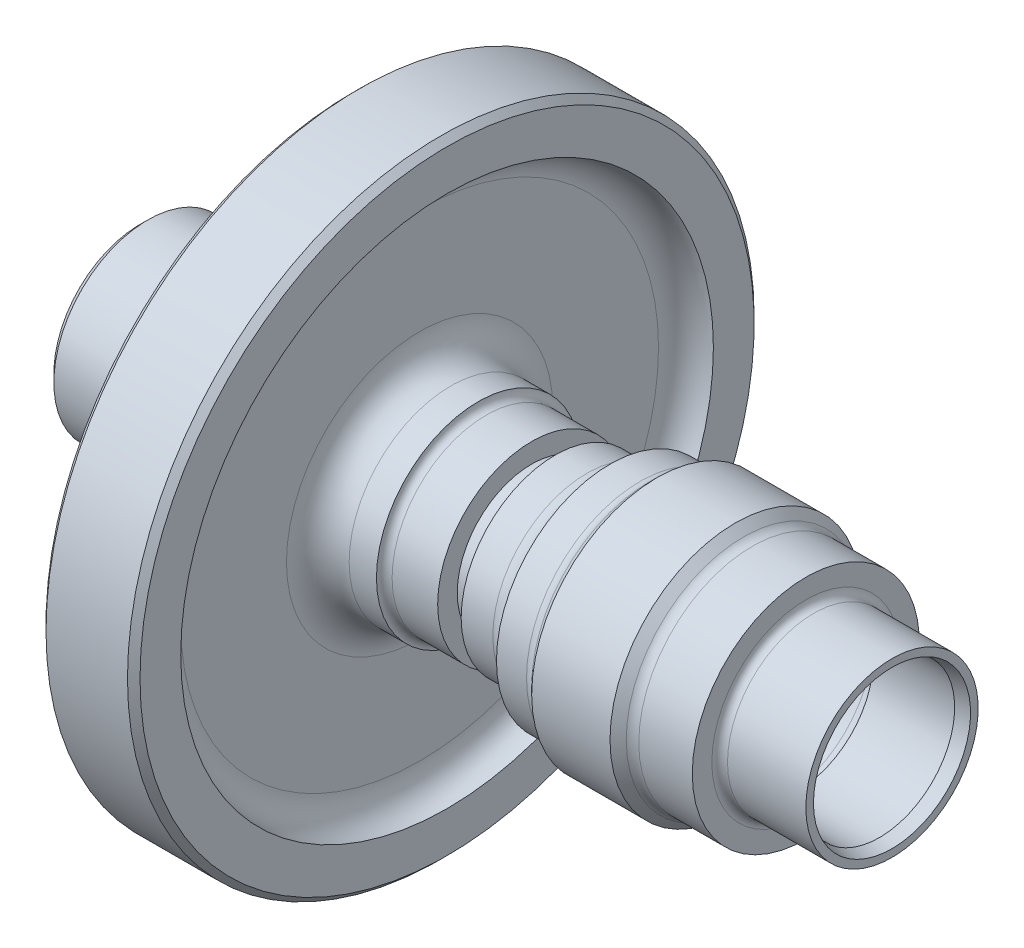
ISO-10303-21;
HEADER;
FILE_DESCRIPTION(('STEP AP214'),'2;1');
FILE_NAME('part.step','',(''),(''),'','','');
FILE_SCHEMA(('AUTOMOTIVE_DESIGN { 1 0 10303 214 1 1 1 1 }'));
ENDSEC;
DATA;
#1=APPLICATION_CONTEXT('core data for automotive mechanical design processes');
#2=APPLICATION_PROTOCOL_DEFINITION('international standard','automotive_design',2000,#1);
#3=PRODUCT_CONTEXT('',#1,'mechanical');
#4=PRODUCT('Part','Part','',(#3));
#5=PRODUCT_RELATED_PRODUCT_CATEGORY('part','',(#4));
#6=PRODUCT_DEFINITION_FORMATION('','',#4);
#7=PRODUCT_DEFINITION_CONTEXT('part definition',#1,'design');
#8=PRODUCT_DEFINITION('design','',#6,#7);
#9=PRODUCT_DEFINITION_SHAPE('','',#8);
#10=(LENGTH_UNIT() NAMED_UNIT(*) SI_UNIT(.MILLI.,.METRE.));
#11=(NAMED_UNIT(*) PLANE_ANGLE_UNIT() SI_UNIT($,.RADIAN.));
#12=(NAMED_UNIT(*) SI_UNIT($,.STERADIAN.) SOLID_ANGLE_UNIT());
#13=UNCERTAINTY_MEASURE_WITH_UNIT(LENGTH_MEASURE(1.E-05),#10,'distance_accuracy_value','');
#14=(GEOMETRIC_REPRESENTATION_CONTEXT(3) GLOBAL_UNCERTAINTY_ASSIGNED_CONTEXT((#13)) GLOBAL_UNIT_ASSIGNED_CONTEXT((#10,
#11,#12)) REPRESENTATION_CONTEXT('',''));
#15=CARTESIAN_POINT('',(0.,0.,0.));
#16=DIRECTION('',(0.,0.,1.));
#17=DIRECTION('',(1.,0.,0.));
#18=AXIS2_PLACEMENT_3D('',#15,#16,#17);
#19=CARTESIAN_POINT('',(171.840617081736,0.,0.));
#20=DIRECTION('',(1.,0.,0.));
#21=DIRECTION('',(0.,0.,-1.));
#22=AXIS2_PLACEMENT_3D('',#19,#20,#21);
#23=CYLINDRICAL_SURFACE('',#22,63.5);
#24=CARTESIAN_POINT('',(44.45,0.,0.));
#25=DIRECTION('',(1.,0.,0.));
#26=DIRECTION('',(0.,0.,-1.));
#27=AXIS2_PLACEMENT_3D('',#24,#25,#26);
#28=CIRCLE('',#27,63.5);
#29=CARTESIAN_POINT('',(44.45,0.,-63.5));
#30=VERTEX_POINT('',#29);
#31=EDGE_CURVE('E10',#30,#30,#28,.T.);
#32=ORIENTED_EDGE('',*,*,#31,.T.);
#33=EDGE_LOOP('',(#32));
#34=FACE_BOUND('',#33,.T.);
#35=CARTESIAN_POINT('',(60.96,0.,0.));
#36=DIRECTION('',(-1.,0.,0.));
#37=DIRECTION('',(0.,0.,1.));
#38=AXIS2_PLACEMENT_3D('',#35,#36,#37);
#39=CIRCLE('',#38,63.5);
#40=CARTESIAN_POINT('',(60.96,0.,63.5));
#41=VERTEX_POINT('',#40);
#42=EDGE_CURVE('E111',#41,#41,#39,.T.);
#43=ORIENTED_EDGE('',*,*,#42,.T.);
#44=EDGE_LOOP('',(#43));
#45=FACE_BOUND('',#44,.T.);
#46=ADVANCED_FACE('F34',(#34,#45),#23,.T.);
#47=CARTESIAN_POINT('',(171.840617081736,0.,0.));
#48=DIRECTION('',(1.,0.,0.));
#49=DIRECTION('',(0.,0.,-1.));
#50=AXIS2_PLACEMENT_3D('',#47,#48,#49);
#51=CYLINDRICAL_SURFACE('',#50,11.90625);
#52=CARTESIAN_POINT('',(26.67,0.,0.));
#53=DIRECTION('',(1.,0.,0.));
#54=DIRECTION('',(0.,0.,-1.));
#55=AXIS2_PLACEMENT_3D('',#52,#53,#54);
#56=CIRCLE('',#55,11.90625);
#57=CARTESIAN_POINT('',(26.67,0.,-11.90625));
#58=VERTEX_POINT('',#57);
#59=EDGE_CURVE('E41',#58,#58,#56,.T.);
#60=ORIENTED_EDGE('',*,*,#59,.F.);
#61=EDGE_LOOP('',(#60));
#62=FACE_BOUND('',#61,.T.);
#63=CARTESIAN_POINT('',(101.6,0.,0.));
#64=DIRECTION('',(-1.,0.,0.));
#65=DIRECTION('',(0.,0.,1.));
#66=AXIS2_PLACEMENT_3D('',#63,#64,#65);
#67=CIRCLE('',#66,11.90625);
#68=CARTESIAN_POINT('',(101.6,0.,11.90625));
#69=VERTEX_POINT('',#68);
#70=EDGE_CURVE('E201',#69,#69,#67,.T.);
#71=ORIENTED_EDGE('',*,*,#70,.F.);
#72=EDGE_LOOP('',(#71));
#73=FACE_BOUND('',#72,.T.);
#74=ADVANCED_FACE('F208',(#62,#73),#51,.F.);
#75=CARTESIAN_POINT('',(43.18,0.,0.));
#76=DIRECTION('',(1.,0.,0.));
#77=DIRECTION('',(0.,0.,-1.));
#78=AXIS2_PLACEMENT_3D('',#75,#76,#77);
#79=CONICAL_SURFACE('',#78,62.23,0.785398163397451);
#80=ORIENTED_EDGE('',*,*,#31,.F.);
#81=EDGE_LOOP('',(#80));
#82=FACE_BOUND('',#81,.T.);
#83=CARTESIAN_POINT('',(43.18,0.,0.));
#84=DIRECTION('',(1.,0.,0.));
#85=DIRECTION('',(0.,0.,-1.));
#86=AXIS2_PLACEMENT_3D('',#83,#84,#85);
#87=CIRCLE('',#86,62.23);
#88=CARTESIAN_POINT('',(43.18,0.,-62.23));
#89=VERTEX_POINT('',#88);
#90=EDGE_CURVE('E108',#89,#89,#87,.T.);
#91=ORIENTED_EDGE('',*,*,#90,.T.);
#92=EDGE_LOOP('',(#91));
#93=FACE_BOUND('',#92,.T.);
#94=ADVANCED_FACE('F36',(#82,#93),#79,.T.);
#95=CARTESIAN_POINT('',(26.67,0.,0.));
#96=DIRECTION('',(-1.,0.,0.));
#97=DIRECTION('',(0.,0.,1.));
#98=AXIS2_PLACEMENT_3D('',#95,#96,#97);
#99=CONICAL_SURFACE('',#98,11.90625,0.78539816339745);
#100=CARTESIAN_POINT('',(25.4,0.,0.));
#101=DIRECTION('',(1.,0.,0.));
#102=DIRECTION('',(0.,0.,-1.));
#103=AXIS2_PLACEMENT_3D('',#100,#101,#102);
#104=CIRCLE('',#103,13.17625);
#105=CARTESIAN_POINT('',(25.4,0.,-13.17625));
#106=VERTEX_POINT('',#105);
#107=EDGE_CURVE('E45',#106,#106,#104,.T.);
#108=ORIENTED_EDGE('',*,*,#107,.F.);
#109=EDGE_LOOP('',(#108));
#110=FACE_BOUND('',#109,.T.);
#111=ORIENTED_EDGE('',*,*,#59,.T.);
#112=EDGE_LOOP('',(#111));
#113=FACE_BOUND('',#112,.T.);
#114=ADVANCED_FACE('F216',(#110,#113),#99,.F.);
#115=CARTESIAN_POINT('',(25.4,13.17625,0.));
#116=DIRECTION('',(1.,0.,0.));
#117=DIRECTION('',(0.,0.,-1.));
#118=AXIS2_PLACEMENT_3D('',#115,#116,#117);
#119=PLANE('',#118);
#120=CARTESIAN_POINT('',(25.4,0.,0.));
#121=DIRECTION('',(1.,0.,0.));
#122=DIRECTION('',(0.,0.,-1.));
#123=AXIS2_PLACEMENT_3D('',#120,#121,#122);
#124=CIRCLE('',#123,15.08125);
#125=CARTESIAN_POINT('',(25.4,0.,-15.08125));
#126=VERTEX_POINT('',#125);
#127=EDGE_CURVE('E49',#126,#126,#124,.T.);
#128=ORIENTED_EDGE('',*,*,#127,.F.);
#129=EDGE_LOOP('',(#128));
#130=FACE_BOUND('',#129,.T.);
#131=ORIENTED_EDGE('',*,*,#107,.T.);
#132=EDGE_LOOP('',(#131));
#133=FACE_BOUND('',#132,.T.);
#134=ADVANCED_FACE('F221',(#130,#133),#119,.F.);
#135=CARTESIAN_POINT('',(23.81885,0.,0.));
#136=DIRECTION('',(1.,0.,0.));
#137=DIRECTION('',(0.,0.,-1.));
#138=AXIS2_PLACEMENT_3D('',#135,#136,#137);
#139=TOROIDAL_SURFACE('',#138,15.08125,1.58115);
#140=CARTESIAN_POINT('',(23.81885,0.,0.));
#141=DIRECTION('',(1.,0.,0.));
#142=DIRECTION('',(0.,0.,-1.));
#143=AXIS2_PLACEMENT_3D('',#140,#141,#142);
#144=CIRCLE('',#143,16.6624);
#145=CARTESIAN_POINT('',(23.81885,0.,-16.6624));
#146=VERTEX_POINT('',#145);
#147=EDGE_CURVE('E54',#146,#146,#144,.T.);
#148=ORIENTED_EDGE('',*,*,#147,.F.);
#149=EDGE_LOOP('',(#148));
#150=FACE_BOUND('',#149,.T.);
#151=ORIENTED_EDGE('',*,*,#127,.T.);
#152=EDGE_LOOP('',(#151));
#153=FACE_BOUND('',#152,.T.);
#154=ADVANCED_FACE('F225',(#150,#153),#139,.F.);
#155=CARTESIAN_POINT('',(171.840617081736,0.,0.));
#156=DIRECTION('',(1.,0.,0.));
#157=DIRECTION('',(0.,0.,-1.));
#158=AXIS2_PLACEMENT_3D('',#155,#156,#157);
#159=CYLINDRICAL_SURFACE('',#158,16.6624);
#160=CARTESIAN_POINT('',(14.1674829090888,0.,0.));
#161=DIRECTION('',(1.,0.,0.));
#162=DIRECTION('',(0.,0.,-1.));
#163=AXIS2_PLACEMENT_3D('',#160,#161,#162);
#164=CIRCLE('',#163,16.6624);
#165=CARTESIAN_POINT('',(14.1674829090888,0.,-16.6624));
#166=VERTEX_POINT('',#165);
#167=EDGE_CURVE('E57',#166,#166,#164,.T.);
#168=ORIENTED_EDGE('',*,*,#167,.F.);
#169=EDGE_LOOP('',(#168));
#170=FACE_BOUND('',#169,.T.);
#171=ORIENTED_EDGE('',*,*,#147,.T.);
#172=EDGE_LOOP('',(#171));
#173=FACE_BOUND('',#172,.T.);
#174=ADVANCED_FACE('F229',(#170,#173),#159,.F.);
#175=CARTESIAN_POINT('',(12.7,0.,0.));
#176=DIRECTION('',(1.,0.,0.));
#177=DIRECTION('',(0.,0.,-1.));
#178=AXIS2_PLACEMENT_3D('',#175,#176,#177);
#179=TOROIDAL_SURFACE('',#178,16.056883558,1.5875);
#180=CARTESIAN_POINT('',(11.1125,0.,0.));
#181=DIRECTION('',(1.,0.,0.));
#182=DIRECTION('',(0.,0.,-1.));
#183=AXIS2_PLACEMENT_3D('',#180,#181,#182);
#184=CIRCLE('',#183,16.056883558);
#185=CARTESIAN_POINT('',(11.1125,0.,-16.056883558));
#186=VERTEX_POINT('',#185);
#187=EDGE_CURVE('E60',#186,#186,#184,.T.);
#188=ORIENTED_EDGE('',*,*,#187,.F.);
#189=EDGE_LOOP('',(#188));
#190=FACE_BOUND('',#189,.T.);
#191=ORIENTED_EDGE('',*,*,#167,.T.);
#192=EDGE_LOOP('',(#191));
#193=FACE_BOUND('',#192,.T.);
#194=ADVANCED_FACE('F233',(#190,#193),#179,.F.);
#195=CARTESIAN_POINT('',(11.1125,15.875,0.));
#196=DIRECTION('',(-1.,0.,0.));
#197=DIRECTION('',(0.,0.,1.));
#198=AXIS2_PLACEMENT_3D('',#195,#196,#197);
#199=PLANE('',#198);
#200=CARTESIAN_POINT('',(11.1125,0.,0.));
#201=DIRECTION('',(1.,0.,0.));
#202=DIRECTION('',(0.,0.,-1.));
#203=AXIS2_PLACEMENT_3D('',#200,#201,#202);
#204=CIRCLE('',#203,15.875);
#205=CARTESIAN_POINT('',(11.1125,0.,-15.875));
#206=VERTEX_POINT('',#205);
#207=EDGE_CURVE('E63',#206,#206,#204,.T.);
#208=ORIENTED_EDGE('',*,*,#207,.F.);
#209=EDGE_LOOP('',(#208));
#210=FACE_BOUND('',#209,.T.);
#211=ORIENTED_EDGE('',*,*,#187,.T.);
#212=EDGE_LOOP('',(#211));
#213=FACE_BOUND('',#212,.T.);
#214=ADVANCED_FACE('F237',(#210,#213),#199,.F.);
#215=CARTESIAN_POINT('',(171.840617081736,0.,0.));
#216=DIRECTION('',(1.,0.,0.));
#217=DIRECTION('',(0.,0.,-1.));
#218=AXIS2_PLACEMENT_3D('',#215,#216,#217);
#219=CYLINDRICAL_SURFACE('',#218,15.875);
#220=CARTESIAN_POINT('',(2.9623153285078,0.,0.));
#221=DIRECTION('',(1.,0.,0.));
#222=DIRECTION('',(0.,0.,-1.));
#223=AXIS2_PLACEMENT_3D('',#220,#221,#222);
#224=CIRCLE('',#223,15.875);
#225=CARTESIAN_POINT('',(2.9623153285078,0.,-15.875));
#226=VERTEX_POINT('',#225);
#227=EDGE_CURVE('E66',#226,#226,#224,.T.);
#228=ORIENTED_EDGE('',*,*,#227,.F.);
#229=EDGE_LOOP('',(#228));
#230=FACE_BOUND('',#229,.T.);
#231=ORIENTED_EDGE('',*,*,#207,.T.);
#232=EDGE_LOOP('',(#231));
#233=FACE_BOUND('',#232,.T.);
#234=ADVANCED_FACE('F241',(#230,#233),#219,.F.);
#235=CARTESIAN_POINT('',(2.9623153285078,0.,0.));
#236=DIRECTION('',(1.,0.,0.));
#237=DIRECTION('',(0.,0.,-1.));
#238=AXIS2_PLACEMENT_3D('',#235,#236,#237);
#239=TOROIDAL_SURFACE('',#238,14.2875,1.5875);
#240=CARTESIAN_POINT('',(1.58749999999999,0.,0.));
#241=DIRECTION('',(1.,0.,0.));
#242=DIRECTION('',(0.,0.,-1.));
#243=AXIS2_PLACEMENT_3D('',#240,#241,#242);
#244=CIRCLE('',#243,15.08125);
#245=CARTESIAN_POINT('',(1.58749999999999,0.,-15.08125));
#246=VERTEX_POINT('',#245);
#247=EDGE_CURVE('E69',#246,#246,#244,.T.);
#248=ORIENTED_EDGE('',*,*,#247,.F.);
#249=EDGE_LOOP('',(#248));
#250=FACE_BOUND('',#249,.T.);
#251=ORIENTED_EDGE('',*,*,#227,.T.);
#252=EDGE_LOOP('',(#251));
#253=FACE_BOUND('',#252,.T.);
#254=ADVANCED_FACE('F245',(#250,#253),#239,.F.);
#255=CARTESIAN_POINT('',(171.840617081736,0.,0.));
#256=DIRECTION('',(1.,0.,0.));
#257=DIRECTION('',(0.,0.,-1.));
#258=AXIS2_PLACEMENT_3D('',#255,#256,#257);
#259=CYLINDRICAL_SURFACE('',#258,15.08125);
#260=CARTESIAN_POINT('',(0.,0.,0.));
#261=DIRECTION('',(1.,0.,0.));
#262=DIRECTION('',(0.,0.,-1.));
#263=AXIS2_PLACEMENT_3D('',#260,#261,#262);
#264=CIRCLE('',#263,15.08125);
#265=CARTESIAN_POINT('',(0.,0.,-15.08125));
#266=VERTEX_POINT('',#265);
#267=EDGE_CURVE('E72',#266,#266,#264,.T.);
#268=ORIENTED_EDGE('',*,*,#267,.F.);
#269=EDGE_LOOP('',(#268));
#270=FACE_BOUND('',#269,.T.);
#271=ORIENTED_EDGE('',*,*,#247,.T.);
#272=EDGE_LOOP('',(#271));
#273=FACE_BOUND('',#272,.T.);
#274=ADVANCED_FACE('F249',(#270,#273),#259,.F.);
#275=CARTESIAN_POINT('',(0.,15.08125,0.));
#276=DIRECTION('',(1.,0.,0.));
#277=DIRECTION('',(0.,0.,-1.));
#278=AXIS2_PLACEMENT_3D('',#275,#276,#277);
#279=PLANE('',#278);
#280=CARTESIAN_POINT('',(0.,0.,0.));
#281=DIRECTION('',(1.,0.,0.));
#282=DIRECTION('',(0.,0.,-1.));
#283=AXIS2_PLACEMENT_3D('',#280,#281,#282);
#284=CIRCLE('',#283,17.4625);
#285=CARTESIAN_POINT('',(0.,0.,-17.4625));
#286=VERTEX_POINT('',#285);
#287=EDGE_CURVE('E75',#286,#286,#284,.T.);
#288=ORIENTED_EDGE('',*,*,#287,.F.);
#289=EDGE_LOOP('',(#288));
#290=FACE_BOUND('',#289,.T.);
#291=ORIENTED_EDGE('',*,*,#267,.T.);
#292=EDGE_LOOP('',(#291));
#293=FACE_BOUND('',#292,.T.);
#294=ADVANCED_FACE('F253',(#290,#293),#279,.F.);
#295=CARTESIAN_POINT('',(0.,0.,0.));
#296=DIRECTION('',(1.,0.,0.));
#297=DIRECTION('',(0.,0.,-1.));
#298=AXIS2_PLACEMENT_3D('',#295,#296,#297);
#299=CONICAL_SURFACE('',#298,17.4625,0.785398163397453);
#300=CARTESIAN_POINT('',(1.58749999999999,0.,0.));
#301=DIRECTION('',(1.,0.,0.));
#302=DIRECTION('',(0.,0.,-1.));
#303=AXIS2_PLACEMENT_3D('',#300,#301,#302);
#304=CIRCLE('',#303,19.05);
#305=CARTESIAN_POINT('',(1.58749999999999,0.,-19.05));
#306=VERTEX_POINT('',#305);
#307=EDGE_CURVE('E78',#306,#306,#304,.T.);
#308=ORIENTED_EDGE('',*,*,#307,.F.);
#309=EDGE_LOOP('',(#308));
#310=FACE_BOUND('',#309,.T.);
#311=ORIENTED_EDGE('',*,*,#287,.T.);
#312=EDGE_LOOP('',(#311));
#313=FACE_BOUND('',#312,.T.);
#314=ADVANCED_FACE('F257',(#310,#313),#299,.T.);
#315=CARTESIAN_POINT('',(171.840617081736,0.,0.));
#316=DIRECTION('',(1.,0.,0.));
#317=DIRECTION('',(0.,0.,-1.));
#318=AXIS2_PLACEMENT_3D('',#315,#316,#317);
#319=CYLINDRICAL_SURFACE('',#318,19.05);
#320=CARTESIAN_POINT('',(16.1925,0.,0.));
#321=DIRECTION('',(1.,0.,0.));
#322=DIRECTION('',(0.,0.,-1.));
#323=AXIS2_PLACEMENT_3D('',#320,#321,#322);
#324=CIRCLE('',#323,19.05);
#325=CARTESIAN_POINT('',(16.1925,0.,-19.05));
#326=VERTEX_POINT('',#325);
#327=EDGE_CURVE('E81',#326,#326,#324,.T.);
#328=ORIENTED_EDGE('',*,*,#327,.F.);
#329=EDGE_LOOP('',(#328));
#330=FACE_BOUND('',#329,.T.);
#331=ORIENTED_EDGE('',*,*,#307,.T.);
#332=EDGE_LOOP('',(#331));
#333=FACE_BOUND('',#332,.T.);
#334=ADVANCED_FACE('F261',(#330,#333),#319,.T.);
#335=CARTESIAN_POINT('',(16.1925,0.,0.));
#336=DIRECTION('',(1.,0.,0.));
#337=DIRECTION('',(0.,0.,-1.));
#338=AXIS2_PLACEMENT_3D('',#335,#336,#337);
#339=TOROIDAL_SURFACE('',#338,20.6375,1.5875);
#340=CARTESIAN_POINT('',(17.78,0.,0.));
#341=DIRECTION('',(1.,0.,0.));
#342=DIRECTION('',(0.,0.,-1.));
#343=AXIS2_PLACEMENT_3D('',#340,#341,#342);
#344=CIRCLE('',#343,20.6375);
#345=CARTESIAN_POINT('',(17.78,0.,-20.6375));
#346=VERTEX_POINT('',#345);
#347=EDGE_CURVE('E84',#346,#346,#344,.T.);
#348=ORIENTED_EDGE('',*,*,#347,.F.);
#349=EDGE_LOOP('',(#348));
#350=FACE_BOUND('',#349,.T.);
#351=ORIENTED_EDGE('',*,*,#327,.T.);
#352=EDGE_LOOP('',(#351));
#353=FACE_BOUND('',#352,.T.);
#354=ADVANCED_FACE('F265',(#350,#353),#339,.F.);
#355=CARTESIAN_POINT('',(17.78,20.6375,0.));
#356=DIRECTION('',(1.,0.,0.));
#357=DIRECTION('',(0.,0.,-1.));
#358=AXIS2_PLACEMENT_3D('',#355,#356,#357);
#359=PLANE('',#358);
#360=CARTESIAN_POINT('',(17.78,0.,0.));
#361=DIRECTION('',(1.,0.,0.));
#362=DIRECTION('',(0.,0.,-1.));
#363=AXIS2_PLACEMENT_3D('',#360,#361,#362);
#364=CIRCLE('',#363,25.4);
#365=CARTESIAN_POINT('',(17.78,0.,-25.4));
#366=VERTEX_POINT('',#365);
#367=EDGE_CURVE('E87',#366,#366,#364,.T.);
#368=ORIENTED_EDGE('',*,*,#367,.F.);
#369=EDGE_LOOP('',(#368));
#370=FACE_BOUND('',#369,.T.);
#371=ORIENTED_EDGE('',*,*,#347,.T.);
#372=EDGE_LOOP('',(#371));
#373=FACE_BOUND('',#372,.T.);
#374=ADVANCED_FACE('F269',(#370,#373),#359,.F.);
#375=CARTESIAN_POINT('',(171.840617081736,0.,0.));
#376=DIRECTION('',(1.,0.,0.));
#377=DIRECTION('',(0.,0.,-1.));
#378=AXIS2_PLACEMENT_3D('',#375,#376,#377);
#379=CYLINDRICAL_SURFACE('',#378,25.4);
#380=CARTESIAN_POINT('',(21.278531992,0.,0.));
#381=DIRECTION('',(1.,0.,0.));
#382=DIRECTION('',(0.,0.,-1.));
#383=AXIS2_PLACEMENT_3D('',#380,#381,#382);
#384=CIRCLE('',#383,25.4);
#385=CARTESIAN_POINT('',(21.278531992,0.,-25.4));
#386=VERTEX_POINT('',#385);
#387=EDGE_CURVE('E90',#386,#386,#384,.T.);
#388=ORIENTED_EDGE('',*,*,#387,.F.);
#389=EDGE_LOOP('',(#388));
#390=FACE_BOUND('',#389,.T.);
#391=ORIENTED_EDGE('',*,*,#367,.T.);
#392=EDGE_LOOP('',(#391));
#393=FACE_BOUND('',#392,.T.);
#394=ADVANCED_FACE('F273',(#390,#393),#379,.T.);
#395=CARTESIAN_POINT('',(26.041031992,0.,0.));
#396=DIRECTION('',(1.,0.,0.));
#397=DIRECTION('',(0.,0.,-1.));
#398=AXIS2_PLACEMENT_3D('',#395,#396,#397);
#399=TOROIDAL_SURFACE('',#398,25.4,4.7625);
#400=CARTESIAN_POINT('',(26.041031992,0.,0.));
#401=DIRECTION('',(1.,0.,0.));
#402=DIRECTION('',(0.,0.,-1.));
#403=AXIS2_PLACEMENT_3D('',#400,#401,#402);
#404=CIRCLE('',#403,20.6375);
#405=CARTESIAN_POINT('',(26.041031992,0.,-20.6375));
#406=VERTEX_POINT('',#405);
#407=EDGE_CURVE('E93',#406,#406,#404,.T.);
#408=ORIENTED_EDGE('',*,*,#407,.F.);
#409=EDGE_LOOP('',(#408));
#410=FACE_BOUND('',#409,.T.);
#411=ORIENTED_EDGE('',*,*,#387,.T.);
#412=EDGE_LOOP('',(#411));
#413=FACE_BOUND('',#412,.T.);
#414=ADVANCED_FACE('F277',(#410,#413),#399,.F.);
#415=CARTESIAN_POINT('',(171.840617081736,0.,0.));
#416=DIRECTION('',(1.,0.,0.));
#417=DIRECTION('',(0.,0.,-1.));
#418=AXIS2_PLACEMENT_3D('',#415,#416,#417);
#419=CYLINDRICAL_SURFACE('',#418,20.6375);
#420=CARTESIAN_POINT('',(42.3926,0.,0.));
#421=DIRECTION('',(1.,0.,0.));
#422=DIRECTION('',(0.,0.,-1.));
#423=AXIS2_PLACEMENT_3D('',#420,#421,#422);
#424=CIRCLE('',#423,20.6375);
#425=CARTESIAN_POINT('',(42.3926,0.,-20.6375));
#426=VERTEX_POINT('',#425);
#427=EDGE_CURVE('E96',#426,#426,#424,.T.);
#428=ORIENTED_EDGE('',*,*,#427,.F.);
#429=EDGE_LOOP('',(#428));
#430=FACE_BOUND('',#429,.T.);
#431=ORIENTED_EDGE('',*,*,#407,.T.);
#432=EDGE_LOOP('',(#431));
#433=FACE_BOUND('',#432,.T.);
#434=ADVANCED_FACE('F281',(#430,#433),#419,.T.);
#435=CARTESIAN_POINT('',(42.3926,0.,0.));
#436=DIRECTION('',(1.,0.,0.));
#437=DIRECTION('',(0.,0.,-1.));
#438=AXIS2_PLACEMENT_3D('',#435,#436,#437);
#439=TOROIDAL_SURFACE('',#438,26.9875,6.35);
#440=CARTESIAN_POINT('',(48.7426,0.,0.));
#441=DIRECTION('',(1.,0.,0.));
#442=DIRECTION('',(0.,0.,-1.));
#443=AXIS2_PLACEMENT_3D('',#440,#441,#442);
#444=CIRCLE('',#443,26.9875);
#445=CARTESIAN_POINT('',(48.7426,0.,-26.9875));
#446=VERTEX_POINT('',#445);
#447=EDGE_CURVE('E99',#446,#446,#444,.T.);
#448=ORIENTED_EDGE('',*,*,#447,.F.);
#449=EDGE_LOOP('',(#448));
#450=FACE_BOUND('',#449,.T.);
#451=ORIENTED_EDGE('',*,*,#427,.T.);
#452=EDGE_LOOP('',(#451));
#453=FACE_BOUND('',#452,.T.);
#454=ADVANCED_FACE('F285',(#450,#453),#439,.F.);
#455=CARTESIAN_POINT('',(48.7426,26.9875,0.));
#456=DIRECTION('',(1.,0.,0.));
#457=DIRECTION('',(0.,0.,-1.));
#458=AXIS2_PLACEMENT_3D('',#455,#456,#457);
#459=PLANE('',#458);
#460=CARTESIAN_POINT('',(48.7426,0.,0.));
#461=DIRECTION('',(1.,0.,0.));
#462=DIRECTION('',(0.,0.,-1.));
#463=AXIS2_PLACEMENT_3D('',#460,#461,#462);
#464=CIRCLE('',#463,48.4124);
#465=CARTESIAN_POINT('',(48.7426,0.,-48.4124));
#466=VERTEX_POINT('',#465);
#467=EDGE_CURVE('E102',#466,#466,#464,.T.);
#468=ORIENTED_EDGE('',*,*,#467,.F.);
#469=EDGE_LOOP('',(#468));
#470=FACE_BOUND('',#469,.T.);
#471=ORIENTED_EDGE('',*,*,#447,.T.);
#472=EDGE_LOOP('',(#471));
#473=FACE_BOUND('',#472,.T.);
#474=ADVANCED_FACE('F289',(#470,#473),#459,.F.);
#475=CARTESIAN_POINT('',(43.18,0.,0.));
#476=DIRECTION('',(1.,0.,0.));
#477=DIRECTION('',(0.,0.,-1.));
#478=AXIS2_PLACEMENT_3D('',#475,#476,#477);
#479=TOROIDAL_SURFACE('',#478,48.4124,5.5626);
#480=CARTESIAN_POINT('',(43.18,0.,0.));
#481=DIRECTION('',(1.,0.,0.));
#482=DIRECTION('',(0.,0.,-1.));
#483=AXIS2_PLACEMENT_3D('',#480,#481,#482);
#484=CIRCLE('',#483,53.975);
#485=CARTESIAN_POINT('',(43.18,0.,-53.975));
#486=VERTEX_POINT('',#485);
#487=EDGE_CURVE('E105',#486,#486,#484,.T.);
#488=ORIENTED_EDGE('',*,*,#487,.F.);
#489=EDGE_LOOP('',(#488));
#490=FACE_BOUND('',#489,.T.);
#491=ORIENTED_EDGE('',*,*,#467,.T.);
#492=EDGE_LOOP('',(#491));
#493=FACE_BOUND('',#492,.T.);
#494=ADVANCED_FACE('F293',(#490,#493),#479,.F.);
#495=CARTESIAN_POINT('',(43.18,53.975,0.));
#496=DIRECTION('',(1.,0.,0.));
#497=DIRECTION('',(0.,0.,-1.));
#498=AXIS2_PLACEMENT_3D('',#495,#496,#497);
#499=PLANE('',#498);
#500=ORIENTED_EDGE('',*,*,#90,.F.);
#501=EDGE_LOOP('',(#500));
#502=FACE_BOUND('',#501,.T.);
#503=ORIENTED_EDGE('',*,*,#487,.T.);
#504=EDGE_LOOP('',(#503));
#505=FACE_BOUND('',#504,.T.);
#506=ADVANCED_FACE('F297',(#502,#505),#499,.F.);
#507=CARTESIAN_POINT('',(60.96,0.,0.));
#508=DIRECTION('',(-1.,0.,0.));
#509=DIRECTION('',(0.,0.,1.));
#510=AXIS2_PLACEMENT_3D('',#507,#508,#509);
#511=CONICAL_SURFACE('',#510,63.5,0.785398163397451);
#512=CARTESIAN_POINT('',(62.23,0.,0.));
#513=DIRECTION('',(-1.,0.,0.));
#514=DIRECTION('',(0.,0.,1.));
#515=AXIS2_PLACEMENT_3D('',#512,#513,#514);
#516=CIRCLE('',#515,62.23);
#517=CARTESIAN_POINT('',(62.23,0.,62.23));
#518=VERTEX_POINT('',#517);
#519=EDGE_CURVE('E114',#518,#518,#516,.T.);
#520=ORIENTED_EDGE('',*,*,#519,.T.);
#521=EDGE_LOOP('',(#520));
#522=FACE_BOUND('',#521,.T.);
#523=ORIENTED_EDGE('',*,*,#42,.F.);
#524=EDGE_LOOP('',(#523));
#525=FACE_BOUND('',#524,.T.);
#526=ADVANCED_FACE('F301',(#522,#525),#511,.T.);
#527=CARTESIAN_POINT('',(62.23,62.23,0.));
#528=DIRECTION('',(1.,0.,0.));
#529=DIRECTION('',(0.,0.,-1.));
#530=AXIS2_PLACEMENT_3D('',#527,#528,#529);
#531=PLANE('',#530);
#532=CARTESIAN_POINT('',(62.23,0.,0.));
#533=DIRECTION('',(-1.,0.,0.));
#534=DIRECTION('',(0.,0.,1.));
#535=AXIS2_PLACEMENT_3D('',#532,#533,#534);
#536=CIRCLE('',#535,53.975);
#537=CARTESIAN_POINT('',(62.23,0.,53.975));
#538=VERTEX_POINT('',#537);
#539=EDGE_CURVE('E117',#538,#538,#536,.T.);
#540=ORIENTED_EDGE('',*,*,#539,.T.);
#541=EDGE_LOOP('',(#540));
#542=FACE_BOUND('',#541,.T.);
#543=ORIENTED_EDGE('',*,*,#519,.F.);
#544=EDGE_LOOP('',(#543));
#545=FACE_BOUND('',#544,.T.);
#546=ADVANCED_FACE('F305',(#542,#545),#531,.T.);
#547=CARTESIAN_POINT('',(62.23,0.,0.));
#548=DIRECTION('',(-1.,0.,0.));
#549=DIRECTION('',(0.,0.,1.));
#550=AXIS2_PLACEMENT_3D('',#547,#548,#549);
#551=TOROIDAL_SURFACE('',#550,48.4124,5.5626);
#552=CARTESIAN_POINT('',(56.6674,0.,0.));
#553=DIRECTION('',(-1.,0.,0.));
#554=DIRECTION('',(0.,0.,1.));
#555=AXIS2_PLACEMENT_3D('',#552,#553,#554);
#556=CIRCLE('',#555,48.4124);
#557=CARTESIAN_POINT('',(56.6674,0.,48.4124));
#558=VERTEX_POINT('',#557);
#559=EDGE_CURVE('E120',#558,#558,#556,.T.);
#560=ORIENTED_EDGE('',*,*,#559,.T.);
#561=EDGE_LOOP('',(#560));
#562=FACE_BOUND('',#561,.T.);
#563=ORIENTED_EDGE('',*,*,#539,.F.);
#564=EDGE_LOOP('',(#563));
#565=FACE_BOUND('',#564,.T.);
#566=ADVANCED_FACE('F309',(#562,#565),#551,.F.);
#567=CARTESIAN_POINT('',(56.6674,48.4124,0.));
#568=DIRECTION('',(1.,0.,0.));
#569=DIRECTION('',(0.,0.,-1.));
#570=AXIS2_PLACEMENT_3D('',#567,#568,#569);
#571=PLANE('',#570);
#572=CARTESIAN_POINT('',(56.6674,0.,0.));
#573=DIRECTION('',(-1.,0.,0.));
#574=DIRECTION('',(0.,0.,1.));
#575=AXIS2_PLACEMENT_3D('',#572,#573,#574);
#576=CIRCLE('',#575,26.9875);
#577=CARTESIAN_POINT('',(56.6674,0.,26.9875));
#578=VERTEX_POINT('',#577);
#579=EDGE_CURVE('E123',#578,#578,#576,.T.);
#580=ORIENTED_EDGE('',*,*,#579,.T.);
#581=EDGE_LOOP('',(#580));
#582=FACE_BOUND('',#581,.T.);
#583=ORIENTED_EDGE('',*,*,#559,.F.);
#584=EDGE_LOOP('',(#583));
#585=FACE_BOUND('',#584,.T.);
#586=ADVANCED_FACE('F313',(#582,#585),#571,.T.);
#587=CARTESIAN_POINT('',(63.0174,0.,0.));
#588=DIRECTION('',(-1.,0.,0.));
#589=DIRECTION('',(0.,0.,1.));
#590=AXIS2_PLACEMENT_3D('',#587,#588,#589);
#591=TOROIDAL_SURFACE('',#590,26.9875,6.35);
#592=CARTESIAN_POINT('',(63.0174,0.,0.));
#593=DIRECTION('',(-1.,0.,0.));
#594=DIRECTION('',(0.,0.,1.));
#595=AXIS2_PLACEMENT_3D('',#592,#593,#594);
#596=CIRCLE('',#595,20.6375);
#597=CARTESIAN_POINT('',(63.0174,0.,20.6375));
#598=VERTEX_POINT('',#597);
#599=EDGE_CURVE('E126',#598,#598,#596,.T.);
#600=ORIENTED_EDGE('',*,*,#599,.T.);
#601=EDGE_LOOP('',(#600));
#602=FACE_BOUND('',#601,.T.);
#603=ORIENTED_EDGE('',*,*,#579,.F.);
#604=EDGE_LOOP('',(#603));
#605=FACE_BOUND('',#604,.T.);
#606=ADVANCED_FACE('F317',(#602,#605),#591,.F.);
#607=CARTESIAN_POINT('',(-11.8138493179237,0.,0.));
#608=DIRECTION('',(-1.,0.,0.));
#609=DIRECTION('',(0.,0.,1.));
#610=AXIS2_PLACEMENT_3D('',#607,#608,#609);
#611=CYLINDRICAL_SURFACE('',#610,20.6375);
#612=CARTESIAN_POINT('',(68.5536348315116,0.,0.));
#613=DIRECTION('',(-1.,0.,0.));
#614=DIRECTION('',(0.,0.,1.));
#615=AXIS2_PLACEMENT_3D('',#612,#613,#614);
#616=CIRCLE('',#615,20.6375);
#617=CARTESIAN_POINT('',(68.5536348315116,0.,20.6375));
#618=VERTEX_POINT('',#617);
#619=EDGE_CURVE('E129',#618,#618,#616,.T.);
#620=ORIENTED_EDGE('',*,*,#619,.T.);
#621=EDGE_LOOP('',(#620));
#622=FACE_BOUND('',#621,.T.);
#623=ORIENTED_EDGE('',*,*,#599,.F.);
#624=EDGE_LOOP('',(#623));
#625=FACE_BOUND('',#624,.T.);
#626=ADVANCED_FACE('F321',(#622,#625),#611,.T.);
#627=CARTESIAN_POINT('',(70.1411348315116,0.,0.));
#628=DIRECTION('',(-1.,0.,0.));
#629=DIRECTION('',(0.,0.,1.));
#630=AXIS2_PLACEMENT_3D('',#627,#628,#629);
#631=TOROIDAL_SURFACE('',#630,20.6375,1.5875);
#632=CARTESIAN_POINT('',(70.1411348315116,0.,0.));
#633=DIRECTION('',(-1.,0.,0.));
#634=DIRECTION('',(0.,0.,1.));
#635=AXIS2_PLACEMENT_3D('',#632,#633,#634);
#636=CIRCLE('',#635,19.05);
#637=CARTESIAN_POINT('',(70.1411348315116,0.,19.05));
#638=VERTEX_POINT('',#637);
#639=EDGE_CURVE('E132',#638,#638,#636,.T.);
#640=ORIENTED_EDGE('',*,*,#639,.T.);
#641=EDGE_LOOP('',(#640));
#642=FACE_BOUND('',#641,.T.);
#643=ORIENTED_EDGE('',*,*,#619,.F.);
#644=EDGE_LOOP('',(#643));
#645=FACE_BOUND('',#644,.T.);
#646=ADVANCED_FACE('F325',(#642,#645),#631,.F.);
#647=CARTESIAN_POINT('',(-11.8138493179237,0.,0.));
#648=DIRECTION('',(-1.,0.,0.));
#649=DIRECTION('',(0.,0.,1.));
#650=AXIS2_PLACEMENT_3D('',#647,#648,#649);
#651=CYLINDRICAL_SURFACE('',#650,19.05);
#652=CARTESIAN_POINT('',(79.375,0.,0.));
#653=DIRECTION('',(-1.,0.,0.));
#654=DIRECTION('',(0.,0.,1.));
#655=AXIS2_PLACEMENT_3D('',#652,#653,#654);
#656=CIRCLE('',#655,19.05);
#657=CARTESIAN_POINT('',(79.375,0.,19.05));
#658=VERTEX_POINT('',#657);
#659=EDGE_CURVE('E135',#658,#658,#656,.T.);
#660=ORIENTED_EDGE('',*,*,#659,.T.);
#661=EDGE_LOOP('',(#660));
#662=FACE_BOUND('',#661,.T.);
#663=ORIENTED_EDGE('',*,*,#639,.F.);
#664=EDGE_LOOP('',(#663));
#665=FACE_BOUND('',#664,.T.);
#666=ADVANCED_FACE('F329',(#662,#665),#651,.T.);
#667=CARTESIAN_POINT('',(79.375,19.05,0.));
#668=DIRECTION('',(1.,0.,0.));
#669=DIRECTION('',(0.,0.,-1.));
#670=AXIS2_PLACEMENT_3D('',#667,#668,#669);
#671=PLANE('',#670);
#672=CARTESIAN_POINT('',(79.375,0.,0.));
#673=DIRECTION('',(-1.,0.,0.));
#674=DIRECTION('',(0.,0.,1.));
#675=AXIS2_PLACEMENT_3D('',#672,#673,#674);
#676=CIRCLE('',#675,15.08125);
#677=CARTESIAN_POINT('',(79.375,0.,15.08125));
#678=VERTEX_POINT('',#677);
#679=EDGE_CURVE('E138',#678,#678,#676,.T.);
#680=ORIENTED_EDGE('',*,*,#679,.T.);
#681=EDGE_LOOP('',(#680));
#682=FACE_BOUND('',#681,.T.);
#683=ORIENTED_EDGE('',*,*,#659,.F.);
#684=EDGE_LOOP('',(#683));
#685=FACE_BOUND('',#684,.T.);
#686=ADVANCED_FACE('F333',(#682,#685),#671,.T.);
#687=CARTESIAN_POINT('',(-11.8138493179237,0.,0.));
#688=DIRECTION('',(-1.,0.,0.));
#689=DIRECTION('',(0.,0.,1.));
#690=AXIS2_PLACEMENT_3D('',#687,#688,#689);
#691=CYLINDRICAL_SURFACE('',#690,15.08125);
#692=CARTESIAN_POINT('',(84.1375,0.,0.));
#693=DIRECTION('',(-1.,0.,0.));
#694=DIRECTION('',(0.,0.,1.));
#695=AXIS2_PLACEMENT_3D('',#692,#693,#694);
#696=CIRCLE('',#695,15.08125);
#697=CARTESIAN_POINT('',(84.1375,0.,15.08125));
#698=VERTEX_POINT('',#697);
#699=EDGE_CURVE('E141',#698,#698,#696,.T.);
#700=ORIENTED_EDGE('',*,*,#699,.T.);
#701=EDGE_LOOP('',(#700));
#702=FACE_BOUND('',#701,.T.);
#703=ORIENTED_EDGE('',*,*,#679,.F.);
#704=EDGE_LOOP('',(#703));
#705=FACE_BOUND('',#704,.T.);
#706=ADVANCED_FACE('F337',(#702,#705),#691,.T.);
#707=CARTESIAN_POINT('',(84.1375,15.08125,0.));
#708=DIRECTION('',(-1.,0.,0.));
#709=DIRECTION('',(0.,0.,1.));
#710=AXIS2_PLACEMENT_3D('',#707,#708,#709);
#711=PLANE('',#710);
#712=CARTESIAN_POINT('',(84.1375,0.,0.));
#713=DIRECTION('',(-1.,0.,0.));
#714=DIRECTION('',(0.,0.,1.));
#715=AXIS2_PLACEMENT_3D('',#712,#713,#714);
#716=CIRCLE('',#715,19.05);
#717=CARTESIAN_POINT('',(84.1375,0.,19.05));
#718=VERTEX_POINT('',#717);
#719=EDGE_CURVE('E144',#718,#718,#716,.T.);
#720=ORIENTED_EDGE('',*,*,#719,.T.);
#721=EDGE_LOOP('',(#720));
#722=FACE_BOUND('',#721,.T.);
#723=ORIENTED_EDGE('',*,*,#699,.F.);
#724=EDGE_LOOP('',(#723));
#725=FACE_BOUND('',#724,.T.);
#726=ADVANCED_FACE('F341',(#722,#725),#711,.T.);
#727=CARTESIAN_POINT('',(-11.8138493179237,0.,0.));
#728=DIRECTION('',(-1.,0.,0.));
#729=DIRECTION('',(0.,0.,1.));
#730=AXIS2_PLACEMENT_3D('',#727,#728,#729);
#731=CYLINDRICAL_SURFACE('',#730,19.05);
#732=CARTESIAN_POINT('',(90.5551894351316,0.,0.));
#733=DIRECTION('',(-1.,0.,0.));
#734=DIRECTION('',(0.,0.,1.));
#735=AXIS2_PLACEMENT_3D('',#732,#733,#734);
#736=CIRCLE('',#735,19.05);
#737=CARTESIAN_POINT('',(90.5551894351316,0.,19.05));
#738=VERTEX_POINT('',#737);
#739=EDGE_CURVE('E147',#738,#738,#736,.T.);
#740=ORIENTED_EDGE('',*,*,#739,.T.);
#741=EDGE_LOOP('',(#740));
#742=FACE_BOUND('',#741,.T.);
#743=ORIENTED_EDGE('',*,*,#719,.F.);
#744=EDGE_LOOP('',(#743));
#745=FACE_BOUND('',#744,.T.);
#746=ADVANCED_FACE('F345',(#742,#745),#731,.T.);
#747=CARTESIAN_POINT('',(90.5551894351316,0.,0.));
#748=DIRECTION('',(-1.,0.,0.));
#749=DIRECTION('',(0.,0.,1.));
#750=AXIS2_PLACEMENT_3D('',#747,#748,#749);
#751=TOROIDAL_SURFACE('',#750,23.8125,4.7625);
#752=CARTESIAN_POINT('',(95.25,0.,0.));
#753=DIRECTION('',(-1.,0.,0.));
#754=DIRECTION('',(0.,0.,1.));
#755=AXIS2_PLACEMENT_3D('',#752,#753,#754);
#756=CIRCLE('',#755,23.0124);
#757=CARTESIAN_POINT('',(95.25,0.,23.0124));
#758=VERTEX_POINT('',#757);
#759=EDGE_CURVE('E150',#758,#758,#756,.T.);
#760=ORIENTED_EDGE('',*,*,#759,.T.);
#761=EDGE_LOOP('',(#760));
#762=FACE_BOUND('',#761,.T.);
#763=ORIENTED_EDGE('',*,*,#739,.F.);
#764=EDGE_LOOP('',(#763));
#765=FACE_BOUND('',#764,.T.);
#766=ADVANCED_FACE('F349',(#762,#765),#751,.F.);
#767=CARTESIAN_POINT('',(-11.8138493179237,0.,0.));
#768=DIRECTION('',(-1.,0.,0.));
#769=DIRECTION('',(0.,0.,1.));
#770=AXIS2_PLACEMENT_3D('',#767,#768,#769);
#771=CYLINDRICAL_SURFACE('',#770,23.0124);
#772=CARTESIAN_POINT('',(101.335297551572,0.,0.));
#773=DIRECTION('',(-1.,0.,0.));
#774=DIRECTION('',(0.,0.,1.));
#775=AXIS2_PLACEMENT_3D('',#772,#773,#774);
#776=CIRCLE('',#775,23.0124);
#777=CARTESIAN_POINT('',(101.335297551572,0.,23.0124));
#778=VERTEX_POINT('',#777);
#779=EDGE_CURVE('E153',#778,#778,#776,.T.);
#780=ORIENTED_EDGE('',*,*,#779,.T.);
#781=EDGE_LOOP('',(#780));
#782=FACE_BOUND('',#781,.T.);
#783=ORIENTED_EDGE('',*,*,#759,.F.);
#784=EDGE_LOOP('',(#783));
#785=FACE_BOUND('',#784,.T.);
#786=ADVANCED_FACE('F353',(#782,#785),#771,.T.);
#787=CARTESIAN_POINT('',(101.335297551572,0.,0.));
#788=DIRECTION('',(-1.,0.,0.));
#789=DIRECTION('',(0.,0.,1.));
#790=AXIS2_PLACEMENT_3D('',#787,#788,#789);
#791=TOROIDAL_SURFACE('',#790,25.5524,2.54);
#792=CARTESIAN_POINT('',(103.131348775786,0.,0.));
#793=DIRECTION('',(-1.,0.,0.));
#794=DIRECTION('',(0.,0.,1.));
#795=AXIS2_PLACEMENT_3D('',#792,#793,#794);
#796=CIRCLE('',#795,23.7563487757862);
#797=CARTESIAN_POINT('',(103.131348775786,0.,23.7563487757862));
#798=VERTEX_POINT('',#797);
#799=EDGE_CURVE('E156',#798,#798,#796,.T.);
#800=ORIENTED_EDGE('',*,*,#799,.T.);
#801=EDGE_LOOP('',(#800));
#802=FACE_BOUND('',#801,.T.);
#803=ORIENTED_EDGE('',*,*,#779,.F.);
#804=EDGE_LOOP('',(#803));
#805=FACE_BOUND('',#804,.T.);
#806=ADVANCED_FACE('F357',(#802,#805),#791,.F.);
#807=CARTESIAN_POINT('',(103.131348775786,0.,0.));
#808=DIRECTION('',(1.,0.,0.));
#809=DIRECTION('',(0.,0.,-1.));
#810=AXIS2_PLACEMENT_3D('',#807,#808,#809);
#811=CONICAL_SURFACE('',#810,23.7563487757862,0.785398163397451);
#812=CARTESIAN_POINT('',(104.775,0.,0.));
#813=DIRECTION('',(-1.,0.,0.));
#814=DIRECTION('',(0.,0.,1.));
#815=AXIS2_PLACEMENT_3D('',#812,#813,#814);
#816=CIRCLE('',#815,25.4);
#817=CARTESIAN_POINT('',(104.775,0.,25.4));
#818=VERTEX_POINT('',#817);
#819=EDGE_CURVE('E159',#818,#818,#816,.T.);
#820=ORIENTED_EDGE('',*,*,#819,.T.);
#821=EDGE_LOOP('',(#820));
#822=FACE_BOUND('',#821,.T.);
#823=ORIENTED_EDGE('',*,*,#799,.F.);
#824=EDGE_LOOP('',(#823));
#825=FACE_BOUND('',#824,.T.);
#826=ADVANCED_FACE('F361',(#822,#825),#811,.T.);
#827=CARTESIAN_POINT('',(-11.8138493179237,0.,0.));
#828=DIRECTION('',(-1.,0.,0.));
#829=DIRECTION('',(0.,0.,1.));
#830=AXIS2_PLACEMENT_3D('',#827,#828,#829);
#831=CYLINDRICAL_SURFACE('',#830,25.4);
#832=CARTESIAN_POINT('',(120.65,0.,0.));
#833=DIRECTION('',(-1.,0.,0.));
#834=DIRECTION('',(0.,0.,1.));
#835=AXIS2_PLACEMENT_3D('',#832,#833,#834);
#836=CIRCLE('',#835,25.4);
#837=CARTESIAN_POINT('',(120.65,0.,25.4));
#838=VERTEX_POINT('',#837);
#839=EDGE_CURVE('E162',#838,#838,#836,.T.);
#840=ORIENTED_EDGE('',*,*,#839,.T.);
#841=EDGE_LOOP('',(#840));
#842=FACE_BOUND('',#841,.T.);
#843=ORIENTED_EDGE('',*,*,#819,.F.);
#844=EDGE_LOOP('',(#843));
#845=FACE_BOUND('',#844,.T.);
#846=ADVANCED_FACE('F365',(#842,#845),#831,.T.);
#847=CARTESIAN_POINT('',(120.65,0.,0.));
#848=DIRECTION('',(-1.,0.,0.));
#849=DIRECTION('',(0.,0.,1.));
#850=AXIS2_PLACEMENT_3D('',#847,#848,#849);
#851=CONICAL_SURFACE('',#850,25.4,0.785398163397447);
#852=CARTESIAN_POINT('',(122.293651224214,0.,0.));
#853=DIRECTION('',(-1.,0.,0.));
#854=DIRECTION('',(0.,0.,1.));
#855=AXIS2_PLACEMENT_3D('',#852,#853,#854);
#856=CIRCLE('',#855,23.7563487757862);
#857=CARTESIAN_POINT('',(122.293651224214,0.,23.7563487757862));
#858=VERTEX_POINT('',#857);
#859=EDGE_CURVE('E165',#858,#858,#856,.T.);
#860=ORIENTED_EDGE('',*,*,#859,.T.);
#861=EDGE_LOOP('',(#860));
#862=FACE_BOUND('',#861,.T.);
#863=ORIENTED_EDGE('',*,*,#839,.F.);
#864=EDGE_LOOP('',(#863));
#865=FACE_BOUND('',#864,.T.);
#866=ADVANCED_FACE('F369',(#862,#865),#851,.T.);
#867=CARTESIAN_POINT('',(124.089702448428,0.,0.));
#868=DIRECTION('',(-1.,0.,0.));
#869=DIRECTION('',(0.,0.,1.));
#870=AXIS2_PLACEMENT_3D('',#867,#868,#869);
#871=TOROIDAL_SURFACE('',#870,25.5524,2.54);
#872=CARTESIAN_POINT('',(124.089702448428,0.,0.));
#873=DIRECTION('',(-1.,0.,0.));
#874=DIRECTION('',(0.,0.,1.));
#875=AXIS2_PLACEMENT_3D('',#872,#873,#874);
#876=CIRCLE('',#875,23.0124);
#877=CARTESIAN_POINT('',(124.089702448428,0.,23.0124));
#878=VERTEX_POINT('',#877);
#879=EDGE_CURVE('E168',#878,#878,#876,.T.);
#880=ORIENTED_EDGE('',*,*,#879,.T.);
#881=EDGE_LOOP('',(#880));
#882=FACE_BOUND('',#881,.T.);
#883=ORIENTED_EDGE('',*,*,#859,.F.);
#884=EDGE_LOOP('',(#883));
#885=FACE_BOUND('',#884,.T.);
#886=ADVANCED_FACE('F373',(#882,#885),#871,.F.);
#887=CARTESIAN_POINT('',(-11.8138493179237,0.,0.));
#888=DIRECTION('',(-1.,0.,0.));
#889=DIRECTION('',(0.,0.,1.));
#890=AXIS2_PLACEMENT_3D('',#887,#888,#889);
#891=CYLINDRICAL_SURFACE('',#890,23.0124);
#892=CARTESIAN_POINT('',(134.9375,0.,0.));
#893=DIRECTION('',(-1.,0.,0.));
#894=DIRECTION('',(0.,0.,1.));
#895=AXIS2_PLACEMENT_3D('',#892,#893,#894);
#896=CIRCLE('',#895,23.0124);
#897=CARTESIAN_POINT('',(134.9375,0.,23.0124));
#898=VERTEX_POINT('',#897);
#899=EDGE_CURVE('E171',#898,#898,#896,.T.);
#900=ORIENTED_EDGE('',*,*,#899,.T.);
#901=EDGE_LOOP('',(#900));
#902=FACE_BOUND('',#901,.T.);
#903=ORIENTED_EDGE('',*,*,#879,.F.);
#904=EDGE_LOOP('',(#903));
#905=FACE_BOUND('',#904,.T.);
#906=ADVANCED_FACE('F377',(#902,#905),#891,.T.);
#907=CARTESIAN_POINT('',(134.9375,23.0124,0.));
#908=DIRECTION('',(1.,0.,0.));
#909=DIRECTION('',(0.,0.,-1.));
#910=AXIS2_PLACEMENT_3D('',#907,#908,#909);
#911=PLANE('',#910);
#912=CARTESIAN_POINT('',(134.9375,0.,0.));
#913=DIRECTION('',(-1.,0.,0.));
#914=DIRECTION('',(0.,0.,1.));
#915=AXIS2_PLACEMENT_3D('',#912,#913,#914);
#916=CIRCLE('',#915,19.05);
#917=CARTESIAN_POINT('',(134.9375,0.,19.05));
#918=VERTEX_POINT('',#917);
#919=EDGE_CURVE('E174',#918,#918,#916,.T.);
#920=ORIENTED_EDGE('',*,*,#919,.T.);
#921=EDGE_LOOP('',(#920));
#922=FACE_BOUND('',#921,.T.);
#923=ORIENTED_EDGE('',*,*,#899,.F.);
#924=EDGE_LOOP('',(#923));
#925=FACE_BOUND('',#924,.T.);
#926=ADVANCED_FACE('F381',(#922,#925),#911,.T.);
#927=CARTESIAN_POINT('',(136.525,0.,0.));
#928=DIRECTION('',(-1.,0.,0.));
#929=DIRECTION('',(0.,0.,1.));
#930=AXIS2_PLACEMENT_3D('',#927,#928,#929);
#931=TOROIDAL_SURFACE('',#930,19.05,1.58750000000002);
#932=CARTESIAN_POINT('',(136.525,0.,0.));
#933=DIRECTION('',(-1.,0.,0.));
#934=DIRECTION('',(0.,0.,1.));
#935=AXIS2_PLACEMENT_3D('',#932,#933,#934);
#936=CIRCLE('',#935,17.4625);
#937=CARTESIAN_POINT('',(136.525,0.,17.4625));
#938=VERTEX_POINT('',#937);
#939=EDGE_CURVE('E177',#938,#938,#936,.T.);
#940=ORIENTED_EDGE('',*,*,#939,.T.);
#941=EDGE_LOOP('',(#940));
#942=FACE_BOUND('',#941,.T.);
#943=ORIENTED_EDGE('',*,*,#919,.F.);
#944=EDGE_LOOP('',(#943));
#945=FACE_BOUND('',#944,.T.);
#946=ADVANCED_FACE('F385',(#942,#945),#931,.F.);
#947=CARTESIAN_POINT('',(-11.8138493179237,0.,0.));
#948=DIRECTION('',(-1.,0.,0.));
#949=DIRECTION('',(0.,0.,1.));
#950=AXIS2_PLACEMENT_3D('',#947,#948,#949);
#951=CYLINDRICAL_SURFACE('',#950,17.4625);
#952=CARTESIAN_POINT('',(152.4,0.,0.));
#953=DIRECTION('',(-1.,0.,0.));
#954=DIRECTION('',(0.,0.,1.));
#955=AXIS2_PLACEMENT_3D('',#952,#953,#954);
#956=CIRCLE('',#955,17.4625);
#957=CARTESIAN_POINT('',(152.4,0.,17.4625));
#958=VERTEX_POINT('',#957);
#959=EDGE_CURVE('E180',#958,#958,#956,.T.);
#960=ORIENTED_EDGE('',*,*,#959,.T.);
#961=EDGE_LOOP('',(#960));
#962=FACE_BOUND('',#961,.T.);
#963=ORIENTED_EDGE('',*,*,#939,.F.);
#964=EDGE_LOOP('',(#963));
#965=FACE_BOUND('',#964,.T.);
#966=ADVANCED_FACE('F389',(#962,#965),#951,.T.);
#967=CARTESIAN_POINT('',(152.4,17.4625,0.));
#968=DIRECTION('',(1.,0.,0.));
#969=DIRECTION('',(0.,0.,-1.));
#970=AXIS2_PLACEMENT_3D('',#967,#968,#969);
#971=PLANE('',#970);
#972=CARTESIAN_POINT('',(152.4,0.,0.));
#973=DIRECTION('',(-1.,0.,0.));
#974=DIRECTION('',(0.,0.,1.));
#975=AXIS2_PLACEMENT_3D('',#972,#973,#974);
#976=CIRCLE('',#975,15.9205909487751);
#977=CARTESIAN_POINT('',(152.4,0.,15.9205909487751));
#978=VERTEX_POINT('',#977);
#979=EDGE_CURVE('E183',#978,#978,#976,.T.);
#980=ORIENTED_EDGE('',*,*,#979,.T.);
#981=EDGE_LOOP('',(#980));
#982=FACE_BOUND('',#981,.T.);
#983=ORIENTED_EDGE('',*,*,#959,.F.);
#984=EDGE_LOOP('',(#983));
#985=FACE_BOUND('',#984,.T.);
#986=ADVANCED_FACE('F393',(#982,#985),#971,.T.);
#987=CARTESIAN_POINT('',(152.4,0.,0.));
#988=DIRECTION('',(1.,0.,0.));
#989=DIRECTION('',(0.,0.,-1.));
#990=AXIS2_PLACEMENT_3D('',#987,#988,#989);
#991=CONICAL_SURFACE('',#990,15.9205909487751,0.261799387799143);
#992=CARTESIAN_POINT('',(149.86,0.,0.));
#993=DIRECTION('',(-1.,0.,0.));
#994=DIRECTION('',(0.,0.,1.));
#995=AXIS2_PLACEMENT_3D('',#992,#993,#994);
#996=CIRCLE('',#995,15.24);
#997=CARTESIAN_POINT('',(149.86,0.,15.24));
#998=VERTEX_POINT('',#997);
#999=EDGE_CURVE('E186',#998,#998,#996,.T.);
#1000=ORIENTED_EDGE('',*,*,#999,.T.);
#1001=EDGE_LOOP('',(#1000));
#1002=FACE_BOUND('',#1001,.T.);
#1003=ORIENTED_EDGE('',*,*,#979,.F.);
#1004=EDGE_LOOP('',(#1003));
#1005=FACE_BOUND('',#1004,.T.);
#1006=ADVANCED_FACE('F397',(#1002,#1005),#991,.F.);
#1007=CARTESIAN_POINT('',(-11.8138493179237,0.,0.));
#1008=DIRECTION('',(-1.,0.,0.));
#1009=DIRECTION('',(0.,0.,1.));
#1010=AXIS2_PLACEMENT_3D('',#1007,#1008,#1009);
#1011=CYLINDRICAL_SURFACE('',#1010,15.24);
#1012=CARTESIAN_POINT('',(133.35,0.,0.));
#1013=DIRECTION('',(-1.,0.,0.));
#1014=DIRECTION('',(0.,0.,1.));
#1015=AXIS2_PLACEMENT_3D('',#1012,#1013,#1014);
#1016=CIRCLE('',#1015,15.24);
#1017=CARTESIAN_POINT('',(133.35,0.,15.24));
#1018=VERTEX_POINT('',#1017);
#1019=EDGE_CURVE('E189',#1018,#1018,#1016,.T.);
#1020=ORIENTED_EDGE('',*,*,#1019,.T.);
#1021=EDGE_LOOP('',(#1020));
#1022=FACE_BOUND('',#1021,.T.);
#1023=ORIENTED_EDGE('',*,*,#999,.F.);
#1024=EDGE_LOOP('',(#1023));
#1025=FACE_BOUND('',#1024,.T.);
#1026=ADVANCED_FACE('F401',(#1022,#1025),#1011,.F.);
#1027=CARTESIAN_POINT('',(129.54,0.,0.));
#1028=DIRECTION('',(-1.,0.,0.));
#1029=DIRECTION('',(0.,0.,1.));
#1030=AXIS2_PLACEMENT_3D('',#1027,#1028,#1029);
#1031=TOROIDAL_SURFACE('',#1030,15.24,3.81000000000001);
#1032=CARTESIAN_POINT('',(129.54,0.,0.));
#1033=DIRECTION('',(-1.,0.,0.));
#1034=DIRECTION('',(0.,0.,1.));
#1035=AXIS2_PLACEMENT_3D('',#1032,#1033,#1034);
#1036=CIRCLE('',#1035,19.05);
#1037=CARTESIAN_POINT('',(129.54,0.,19.05));
#1038=VERTEX_POINT('',#1037);
#1039=EDGE_CURVE('E192',#1038,#1038,#1036,.T.);
#1040=ORIENTED_EDGE('',*,*,#1039,.T.);
#1041=EDGE_LOOP('',(#1040));
#1042=FACE_BOUND('',#1041,.T.);
#1043=ORIENTED_EDGE('',*,*,#1019,.F.);
#1044=EDGE_LOOP('',(#1043));
#1045=FACE_BOUND('',#1044,.T.);
#1046=ADVANCED_FACE('F405',(#1042,#1045),#1031,.F.);
#1047=CARTESIAN_POINT('',(-11.8138493179237,0.,0.));
#1048=DIRECTION('',(-1.,0.,0.));
#1049=DIRECTION('',(0.,0.,1.));
#1050=AXIS2_PLACEMENT_3D('',#1047,#1048,#1049);
#1051=CYLINDRICAL_SURFACE('',#1050,19.05);
#1052=CARTESIAN_POINT('',(106.68,0.,0.));
#1053=DIRECTION('',(-1.,0.,0.));
#1054=DIRECTION('',(0.,0.,1.));
#1055=AXIS2_PLACEMENT_3D('',#1052,#1053,#1054);
#1056=CIRCLE('',#1055,19.05);
#1057=CARTESIAN_POINT('',(106.68,0.,19.05));
#1058=VERTEX_POINT('',#1057);
#1059=EDGE_CURVE('E195',#1058,#1058,#1056,.T.);
#1060=ORIENTED_EDGE('',*,*,#1059,.T.);
#1061=EDGE_LOOP('',(#1060));
#1062=FACE_BOUND('',#1061,.T.);
#1063=ORIENTED_EDGE('',*,*,#1039,.F.);
#1064=EDGE_LOOP('',(#1063));
#1065=FACE_BOUND('',#1064,.T.);
#1066=ADVANCED_FACE('F409',(#1062,#1065),#1051,.F.);
#1067=CARTESIAN_POINT('',(106.68,0.,0.));
#1068=DIRECTION('',(-1.,0.,0.));
#1069=DIRECTION('',(0.,0.,1.));
#1070=AXIS2_PLACEMENT_3D('',#1067,#1068,#1069);
#1071=TOROIDAL_SURFACE('',#1070,13.97,5.07999999999999);
#1072=CARTESIAN_POINT('',(101.6,0.,0.));
#1073=DIRECTION('',(-1.,0.,0.));
#1074=DIRECTION('',(0.,0.,1.));
#1075=AXIS2_PLACEMENT_3D('',#1072,#1073,#1074);
#1076=CIRCLE('',#1075,13.97);
#1077=CARTESIAN_POINT('',(101.6,0.,13.97));
#1078=VERTEX_POINT('',#1077);
#1079=EDGE_CURVE('E198',#1078,#1078,#1076,.T.);
#1080=ORIENTED_EDGE('',*,*,#1079,.T.);
#1081=EDGE_LOOP('',(#1080));
#1082=FACE_BOUND('',#1081,.T.);
#1083=ORIENTED_EDGE('',*,*,#1059,.F.);
#1084=EDGE_LOOP('',(#1083));
#1085=FACE_BOUND('',#1084,.T.);
#1086=ADVANCED_FACE('F413',(#1082,#1085),#1071,.F.);
#1087=CARTESIAN_POINT('',(101.6,13.97,0.));
#1088=DIRECTION('',(1.,0.,0.));
#1089=DIRECTION('',(0.,0.,-1.));
#1090=AXIS2_PLACEMENT_3D('',#1087,#1088,#1089);
#1091=PLANE('',#1090);
#1092=ORIENTED_EDGE('',*,*,#70,.T.);
#1093=EDGE_LOOP('',(#1092));
#1094=FACE_BOUND('',#1093,.T.);
#1095=ORIENTED_EDGE('',*,*,#1079,.F.);
#1096=EDGE_LOOP('',(#1095));
#1097=FACE_BOUND('',#1096,.T.);
#1098=ADVANCED_FACE('F205',(#1094,#1097),#1091,.T.);
#1099=CLOSED_SHELL('',(#46,#74,#94,#114,#134,#154,#174,#194,#214,#234,#254,#274,#294,#314,#334,
#354,#374,#394,#414,#434,#454,#474,#494,#506,#526,#546,#566,#586,#606,#626,#646,#666,#686,#706,
#726,#746,#766,#786,#806,#826,#846,#866,#886,#906,#926,#946,#966,#986,#1006,#1026,#1046,#1066,
#1086,#1098));
#1100=MANIFOLD_SOLID_BREP('B2',#1099);
#1101=ADVANCED_BREP_SHAPE_REPRESENTATION('',(#18,#1100),#14);
#1102=SHAPE_DEFINITION_REPRESENTATION(#9,#1101);
ENDSEC;
END-ISO-10303-21;
